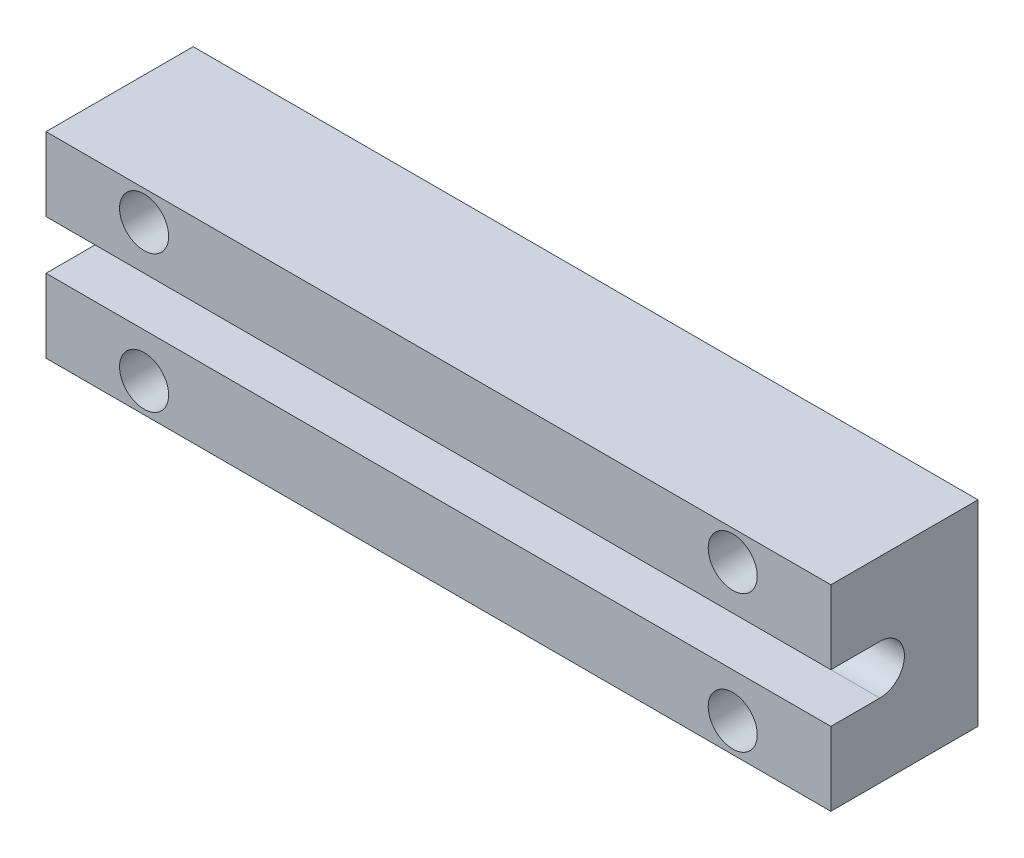
ISO-10303-21;
HEADER;
FILE_DESCRIPTION(('STEP AP214'),'2;1');
FILE_NAME('part.step','',(''),(''),'','','');
FILE_SCHEMA(('AUTOMOTIVE_DESIGN { 1 0 10303 214 1 1 1 1 }'));
ENDSEC;
DATA;
#1=APPLICATION_CONTEXT('core data for automotive mechanical design processes');
#2=APPLICATION_PROTOCOL_DEFINITION('international standard','automotive_design',2000,#1);
#3=PRODUCT_CONTEXT('',#1,'mechanical');
#4=PRODUCT('Part','Part','',(#3));
#5=PRODUCT_RELATED_PRODUCT_CATEGORY('part','',(#4));
#6=PRODUCT_DEFINITION_FORMATION('','',#4);
#7=PRODUCT_DEFINITION_CONTEXT('part definition',#1,'design');
#8=PRODUCT_DEFINITION('design','',#6,#7);
#9=PRODUCT_DEFINITION_SHAPE('','',#8);
#10=(LENGTH_UNIT() NAMED_UNIT(*) SI_UNIT(.MILLI.,.METRE.));
#11=(NAMED_UNIT(*) PLANE_ANGLE_UNIT() SI_UNIT($,.RADIAN.));
#12=(NAMED_UNIT(*) SI_UNIT($,.STERADIAN.) SOLID_ANGLE_UNIT());
#13=UNCERTAINTY_MEASURE_WITH_UNIT(LENGTH_MEASURE(1.E-05),#10,'distance_accuracy_value','');
#14=(GEOMETRIC_REPRESENTATION_CONTEXT(3) GLOBAL_UNCERTAINTY_ASSIGNED_CONTEXT((#13)) GLOBAL_UNIT_ASSIGNED_CONTEXT((#10,
#11,#12)) REPRESENTATION_CONTEXT('',''));
#15=CARTESIAN_POINT('',(0.,0.,0.));
#16=DIRECTION('',(0.,0.,1.));
#17=DIRECTION('',(1.,0.,0.));
#18=AXIS2_PLACEMENT_3D('',#15,#16,#17);
#19=CARTESIAN_POINT('',(0.,0.,15.));
#20=DIRECTION('',(0.,0.,1.));
#21=DIRECTION('',(1.,0.,0.));
#22=AXIS2_PLACEMENT_3D('',#19,#20,#21);
#23=PLANE('',#22);
#24=CARTESIAN_POINT('',(-70.,17.,15.));
#25=DIRECTION('',(0.,0.,1.));
#26=DIRECTION('',(1.,0.,0.));
#27=AXIS2_PLACEMENT_3D('',#24,#25,#26);
#28=CIRCLE('',#27,2.5);
#29=CARTESIAN_POINT('',(-67.5,17.,15.));
#30=VERTEX_POINT('',#29);
#31=EDGE_CURVE('E189',#30,#30,#28,.T.);
#32=ORIENTED_EDGE('',*,*,#31,.F.);
#33=EDGE_LOOP('',(#32));
#34=FACE_BOUND('',#33,.T.);
#35=CARTESIAN_POINT('',(-10.,17.,15.));
#36=DIRECTION('',(0.,0.,1.));
#37=DIRECTION('',(1.,0.,0.));
#38=AXIS2_PLACEMENT_3D('',#35,#36,#37);
#39=CIRCLE('',#38,2.5);
#40=CARTESIAN_POINT('',(-7.5,17.,15.));
#41=VERTEX_POINT('',#40);
#42=EDGE_CURVE('E122',#41,#41,#39,.T.);
#43=ORIENTED_EDGE('',*,*,#42,.F.);
#44=EDGE_LOOP('',(#43));
#45=FACE_BOUND('',#44,.T.);
#46=DIRECTION('',(-1.,0.,0.));
#47=VECTOR('',#46,1.);
#48=CARTESIAN_POINT('',(0.,12.5,15.));
#49=LINE('',#48,#47);
#50=CARTESIAN_POINT('',(0.,12.5,15.));
#51=VERTEX_POINT('',#50);
#52=CARTESIAN_POINT('',(-80.,12.5,15.));
#53=VERTEX_POINT('',#52);
#54=EDGE_CURVE('E41',#51,#53,#49,.T.);
#55=ORIENTED_EDGE('',*,*,#54,.F.);
#56=DIRECTION('',(0.,1.,0.));
#57=VECTOR('',#56,1.);
#58=CARTESIAN_POINT('',(0.,0.,15.));
#59=LINE('',#58,#57);
#60=CARTESIAN_POINT('',(0.,20.,15.));
#61=VERTEX_POINT('',#60);
#62=EDGE_CURVE('E86',#51,#61,#59,.T.);
#63=ORIENTED_EDGE('',*,*,#62,.T.);
#64=DIRECTION('',(-1.,0.,0.));
#65=VECTOR('',#64,1.);
#66=CARTESIAN_POINT('',(0.,20.,15.));
#67=LINE('',#66,#65);
#68=CARTESIAN_POINT('',(-80.,20.,15.));
#69=VERTEX_POINT('',#68);
#70=EDGE_CURVE('E125',#61,#69,#67,.T.);
#71=ORIENTED_EDGE('',*,*,#70,.T.);
#72=DIRECTION('',(0.,-1.,0.));
#73=VECTOR('',#72,1.);
#74=CARTESIAN_POINT('',(-80.,0.,15.));
#75=LINE('',#74,#73);
#76=EDGE_CURVE('E133',#69,#53,#75,.T.);
#77=ORIENTED_EDGE('',*,*,#76,.T.);
#78=EDGE_LOOP('',(#55,#63,#71,#77));
#79=FACE_BOUND('',#78,.T.);
#80=ADVANCED_FACE('F33',(#34,#45,#79),#23,.T.);
#81=CARTESIAN_POINT('',(0.,0.,15.));
#82=DIRECTION('',(-1.,0.,0.));
#83=DIRECTION('',(0.,0.,1.));
#84=AXIS2_PLACEMENT_3D('',#81,#82,#83);
#85=PLANE('',#84);
#86=ORIENTED_EDGE('',*,*,#62,.F.);
#87=DIRECTION('',(0.,0.,1.));
#88=VECTOR('',#87,1.);
#89=CARTESIAN_POINT('',(0.,12.5,15.));
#90=LINE('',#89,#88);
#91=CARTESIAN_POINT('',(0.,12.5,10.));
#92=VERTEX_POINT('',#91);
#93=EDGE_CURVE('E157',#92,#51,#90,.T.);
#94=ORIENTED_EDGE('',*,*,#93,.F.);
#95=CARTESIAN_POINT('',(0.,10.,10.));
#96=DIRECTION('',(1.,0.,0.));
#97=DIRECTION('',(0.,0.,-1.));
#98=AXIS2_PLACEMENT_3D('',#95,#96,#97);
#99=CIRCLE('',#98,2.5);
#100=CARTESIAN_POINT('',(0.,7.5,10.));
#101=VERTEX_POINT('',#100);
#102=EDGE_CURVE('E121',#101,#92,#99,.T.);
#103=ORIENTED_EDGE('',*,*,#102,.F.);
#104=DIRECTION('',(0.,0.,-1.));
#105=VECTOR('',#104,1.);
#106=CARTESIAN_POINT('',(0.,7.5,15.));
#107=LINE('',#106,#105);
#108=CARTESIAN_POINT('',(0.,7.5,15.));
#109=VERTEX_POINT('',#108);
#110=EDGE_CURVE('E111',#109,#101,#107,.T.);
#111=ORIENTED_EDGE('',*,*,#110,.F.);
#112=CARTESIAN_POINT('',(0.,0.,15.));
#113=VERTEX_POINT('',#112);
#114=EDGE_CURVE('E118',#113,#109,#59,.T.);
#115=ORIENTED_EDGE('',*,*,#114,.F.);
#116=DIRECTION('',(0.,0.,-1.));
#117=VECTOR('',#116,1.);
#118=CARTESIAN_POINT('',(0.,0.,15.));
#119=LINE('',#118,#117);
#120=CARTESIAN_POINT('',(0.,0.,0.));
#121=VERTEX_POINT('',#120);
#122=EDGE_CURVE('E137',#113,#121,#119,.T.);
#123=ORIENTED_EDGE('',*,*,#122,.T.);
#124=DIRECTION('',(0.,1.,0.));
#125=VECTOR('',#124,1.);
#126=CARTESIAN_POINT('',(0.,0.,0.));
#127=LINE('',#126,#125);
#128=CARTESIAN_POINT('',(0.,20.,0.));
#129=VERTEX_POINT('',#128);
#130=EDGE_CURVE('E138',#121,#129,#127,.T.);
#131=ORIENTED_EDGE('',*,*,#130,.T.);
#132=DIRECTION('',(0.,0.,-1.));
#133=VECTOR('',#132,1.);
#134=CARTESIAN_POINT('',(0.,20.,15.));
#135=LINE('',#134,#133);
#136=EDGE_CURVE('E114',#61,#129,#135,.T.);
#137=ORIENTED_EDGE('',*,*,#136,.F.);
#138=EDGE_LOOP('',(#86,#94,#103,#111,#115,#123,#131,#137));
#139=FACE_BOUND('',#138,.T.);
#140=ADVANCED_FACE('F35',(#139),#85,.F.);
#141=CARTESIAN_POINT('',(0.,20.,15.));
#142=DIRECTION('',(0.,-1.,0.));
#143=DIRECTION('',(1.,0.,0.));
#144=AXIS2_PLACEMENT_3D('',#141,#142,#143);
#145=PLANE('',#144);
#146=DIRECTION('',(-1.,0.,0.));
#147=VECTOR('',#146,1.);
#148=CARTESIAN_POINT('',(0.,20.,0.));
#149=LINE('',#148,#147);
#150=CARTESIAN_POINT('',(-80.,20.,0.));
#151=VERTEX_POINT('',#150);
#152=EDGE_CURVE('E141',#129,#151,#149,.T.);
#153=ORIENTED_EDGE('',*,*,#152,.T.);
#154=DIRECTION('',(0.,0.,-1.));
#155=VECTOR('',#154,1.);
#156=CARTESIAN_POINT('',(-80.,20.,15.));
#157=LINE('',#156,#155);
#158=EDGE_CURVE('E149',#69,#151,#157,.T.);
#159=ORIENTED_EDGE('',*,*,#158,.F.);
#160=ORIENTED_EDGE('',*,*,#70,.F.);
#161=ORIENTED_EDGE('',*,*,#136,.T.);
#162=EDGE_LOOP('',(#153,#159,#160,#161));
#163=FACE_BOUND('',#162,.T.);
#164=ADVANCED_FACE('F164',(#163),#145,.F.);
#165=CARTESIAN_POINT('',(-80.,0.,15.));
#166=DIRECTION('',(1.,0.,0.));
#167=DIRECTION('',(0.,0.,-1.));
#168=AXIS2_PLACEMENT_3D('',#165,#166,#167);
#169=PLANE('',#168);
#170=CARTESIAN_POINT('',(-80.,10.,10.));
#171=DIRECTION('',(1.,0.,0.));
#172=DIRECTION('',(0.,0.,-1.));
#173=AXIS2_PLACEMENT_3D('',#170,#171,#172);
#174=CIRCLE('',#173,2.5);
#175=CARTESIAN_POINT('',(-80.,7.5,10.));
#176=VERTEX_POINT('',#175);
#177=CARTESIAN_POINT('',(-80.,12.5,10.));
#178=VERTEX_POINT('',#177);
#179=EDGE_CURVE('E11',#176,#178,#174,.T.);
#180=ORIENTED_EDGE('',*,*,#179,.T.);
#181=DIRECTION('',(0.,0.,1.));
#182=VECTOR('',#181,1.);
#183=CARTESIAN_POINT('',(-80.,12.5,15.));
#184=LINE('',#183,#182);
#185=EDGE_CURVE('E130',#178,#53,#184,.T.);
#186=ORIENTED_EDGE('',*,*,#185,.T.);
#187=ORIENTED_EDGE('',*,*,#76,.F.);
#188=ORIENTED_EDGE('',*,*,#158,.T.);
#189=DIRECTION('',(0.,-1.,0.));
#190=VECTOR('',#189,1.);
#191=CARTESIAN_POINT('',(-80.,0.,0.));
#192=LINE('',#191,#190);
#193=CARTESIAN_POINT('',(-80.,0.,0.));
#194=VERTEX_POINT('',#193);
#195=EDGE_CURVE('E143',#151,#194,#192,.T.);
#196=ORIENTED_EDGE('',*,*,#195,.T.);
#197=DIRECTION('',(0.,0.,-1.));
#198=VECTOR('',#197,1.);
#199=CARTESIAN_POINT('',(-80.,0.,15.));
#200=LINE('',#199,#198);
#201=CARTESIAN_POINT('',(-80.,0.,15.));
#202=VERTEX_POINT('',#201);
#203=EDGE_CURVE('E147',#202,#194,#200,.T.);
#204=ORIENTED_EDGE('',*,*,#203,.F.);
#205=CARTESIAN_POINT('',(-80.,7.5,15.));
#206=VERTEX_POINT('',#205);
#207=EDGE_CURVE('E127',#206,#202,#75,.T.);
#208=ORIENTED_EDGE('',*,*,#207,.F.);
#209=DIRECTION('',(0.,0.,-1.));
#210=VECTOR('',#209,1.);
#211=CARTESIAN_POINT('',(-80.,7.5,15.));
#212=LINE('',#211,#210);
#213=EDGE_CURVE('E48',#206,#176,#212,.T.);
#214=ORIENTED_EDGE('',*,*,#213,.T.);
#215=EDGE_LOOP('',(#180,#186,#187,#188,#196,#204,#208,#214));
#216=FACE_BOUND('',#215,.T.);
#217=ADVANCED_FACE('F160',(#216),#169,.F.);
#218=CARTESIAN_POINT('',(0.,0.,15.));
#219=DIRECTION('',(0.,1.,0.));
#220=DIRECTION('',(-1.,0.,0.));
#221=AXIS2_PLACEMENT_3D('',#218,#219,#220);
#222=PLANE('',#221);
#223=DIRECTION('',(1.,0.,0.));
#224=VECTOR('',#223,1.);
#225=CARTESIAN_POINT('',(0.,0.,0.));
#226=LINE('',#225,#224);
#227=EDGE_CURVE('E78',#194,#121,#226,.T.);
#228=ORIENTED_EDGE('',*,*,#227,.T.);
#229=ORIENTED_EDGE('',*,*,#122,.F.);
#230=DIRECTION('',(1.,0.,0.));
#231=VECTOR('',#230,1.);
#232=CARTESIAN_POINT('',(0.,0.,15.));
#233=LINE('',#232,#231);
#234=EDGE_CURVE('E57',#202,#113,#233,.T.);
#235=ORIENTED_EDGE('',*,*,#234,.F.);
#236=ORIENTED_EDGE('',*,*,#203,.T.);
#237=EDGE_LOOP('',(#228,#229,#235,#236));
#238=FACE_BOUND('',#237,.T.);
#239=ADVANCED_FACE('F170',(#238),#222,.F.);
#240=CARTESIAN_POINT('',(-70.,2.99999999999999,15.));
#241=DIRECTION('',(0.,0.,1.));
#242=DIRECTION('',(1.,0.,0.));
#243=AXIS2_PLACEMENT_3D('',#240,#241,#242);
#244=CIRCLE('',#243,2.5);
#245=CARTESIAN_POINT('',(-67.5,2.99999999999999,15.));
#246=VERTEX_POINT('',#245);
#247=EDGE_CURVE('E195',#246,#246,#244,.T.);
#248=ORIENTED_EDGE('',*,*,#247,.F.);
#249=EDGE_LOOP('',(#248));
#250=FACE_BOUND('',#249,.T.);
#251=CARTESIAN_POINT('',(-9.99999999999999,2.99999999999999,15.));
#252=DIRECTION('',(0.,0.,1.));
#253=DIRECTION('',(1.,0.,0.));
#254=AXIS2_PLACEMENT_3D('',#251,#252,#253);
#255=CIRCLE('',#254,2.5);
#256=CARTESIAN_POINT('',(-7.49999999999999,2.99999999999999,15.));
#257=VERTEX_POINT('',#256);
#258=EDGE_CURVE('E183',#257,#257,#255,.T.);
#259=ORIENTED_EDGE('',*,*,#258,.F.);
#260=EDGE_LOOP('',(#259));
#261=FACE_BOUND('',#260,.T.);
#262=DIRECTION('',(1.,0.,0.));
#263=VECTOR('',#262,1.);
#264=CARTESIAN_POINT('',(0.,7.5,15.));
#265=LINE('',#264,#263);
#266=EDGE_CURVE('E108',#206,#109,#265,.T.);
#267=ORIENTED_EDGE('',*,*,#266,.F.);
#268=ORIENTED_EDGE('',*,*,#207,.T.);
#269=ORIENTED_EDGE('',*,*,#234,.T.);
#270=ORIENTED_EDGE('',*,*,#114,.T.);
#271=EDGE_LOOP('',(#267,#268,#269,#270));
#272=FACE_BOUND('',#271,.T.);
#273=ADVANCED_FACE('F124',(#250,#261,#272),#23,.T.);
#274=CARTESIAN_POINT('',(0.,0.,0.));
#275=DIRECTION('',(0.,0.,1.));
#276=DIRECTION('',(1.,0.,0.));
#277=AXIS2_PLACEMENT_3D('',#274,#275,#276);
#278=PLANE('',#277);
#279=CARTESIAN_POINT('',(-70.,2.99999999999999,0.));
#280=DIRECTION('',(0.,0.,-1.));
#281=DIRECTION('',(-1.,0.,0.));
#282=AXIS2_PLACEMENT_3D('',#279,#280,#281);
#283=CIRCLE('',#282,2.5);
#284=CARTESIAN_POINT('',(-72.5,2.99999999999999,0.));
#285=VERTEX_POINT('',#284);
#286=EDGE_CURVE('E198',#285,#285,#283,.T.);
#287=ORIENTED_EDGE('',*,*,#286,.F.);
#288=EDGE_LOOP('',(#287));
#289=FACE_BOUND('',#288,.T.);
#290=CARTESIAN_POINT('',(-70.,17.,0.));
#291=DIRECTION('',(0.,0.,-1.));
#292=DIRECTION('',(-1.,0.,0.));
#293=AXIS2_PLACEMENT_3D('',#290,#291,#292);
#294=CIRCLE('',#293,2.5);
#295=CARTESIAN_POINT('',(-72.5,17.,0.));
#296=VERTEX_POINT('',#295);
#297=EDGE_CURVE('E192',#296,#296,#294,.T.);
#298=ORIENTED_EDGE('',*,*,#297,.F.);
#299=EDGE_LOOP('',(#298));
#300=FACE_BOUND('',#299,.T.);
#301=CARTESIAN_POINT('',(-9.99999999999999,2.99999999999999,0.));
#302=DIRECTION('',(0.,0.,-1.));
#303=DIRECTION('',(-1.,0.,0.));
#304=AXIS2_PLACEMENT_3D('',#301,#302,#303);
#305=CIRCLE('',#304,2.5);
#306=CARTESIAN_POINT('',(-12.5,2.99999999999999,0.));
#307=VERTEX_POINT('',#306);
#308=EDGE_CURVE('E186',#307,#307,#305,.T.);
#309=ORIENTED_EDGE('',*,*,#308,.F.);
#310=EDGE_LOOP('',(#309));
#311=FACE_BOUND('',#310,.T.);
#312=CARTESIAN_POINT('',(-10.,17.,0.));
#313=DIRECTION('',(0.,0.,-1.));
#314=DIRECTION('',(-1.,0.,0.));
#315=AXIS2_PLACEMENT_3D('',#312,#313,#314);
#316=CIRCLE('',#315,2.5);
#317=CARTESIAN_POINT('',(-12.5,17.,0.));
#318=VERTEX_POINT('',#317);
#319=EDGE_CURVE('E180',#318,#318,#316,.T.);
#320=ORIENTED_EDGE('',*,*,#319,.F.);
#321=EDGE_LOOP('',(#320));
#322=FACE_BOUND('',#321,.T.);
#323=ORIENTED_EDGE('',*,*,#130,.F.);
#324=ORIENTED_EDGE('',*,*,#227,.F.);
#325=ORIENTED_EDGE('',*,*,#195,.F.);
#326=ORIENTED_EDGE('',*,*,#152,.F.);
#327=EDGE_LOOP('',(#323,#324,#325,#326));
#328=FACE_BOUND('',#327,.T.);
#329=ADVANCED_FACE('F169',(#289,#300,#311,#322,#328),#278,.F.);
#330=CARTESIAN_POINT('',(-94.,10.,10.));
#331=DIRECTION('',(1.,0.,0.));
#332=DIRECTION('',(0.,0.,-1.));
#333=AXIS2_PLACEMENT_3D('',#330,#331,#332);
#334=CYLINDRICAL_SURFACE('',#333,2.5);
#335=DIRECTION('',(1.,0.,0.));
#336=VECTOR('',#335,1.);
#337=CARTESIAN_POINT('',(-94.,7.5,10.));
#338=LINE('',#337,#336);
#339=EDGE_CURVE('E172',#176,#101,#338,.T.);
#340=ORIENTED_EDGE('',*,*,#339,.T.);
#341=ORIENTED_EDGE('',*,*,#102,.T.);
#342=DIRECTION('',(1.,0.,0.));
#343=VECTOR('',#342,1.);
#344=CARTESIAN_POINT('',(-94.,12.5,10.));
#345=LINE('',#344,#343);
#346=EDGE_CURVE('E171',#178,#92,#345,.T.);
#347=ORIENTED_EDGE('',*,*,#346,.F.);
#348=ORIENTED_EDGE('',*,*,#179,.F.);
#349=EDGE_LOOP('',(#340,#341,#347,#348));
#350=FACE_BOUND('',#349,.T.);
#351=ADVANCED_FACE('F206',(#350),#334,.F.);
#352=CARTESIAN_POINT('',(-94.,12.5,15.));
#353=DIRECTION('',(0.,1.,0.));
#354=DIRECTION('',(0.,0.,1.));
#355=AXIS2_PLACEMENT_3D('',#352,#353,#354);
#356=PLANE('',#355);
#357=ORIENTED_EDGE('',*,*,#346,.T.);
#358=ORIENTED_EDGE('',*,*,#93,.T.);
#359=ORIENTED_EDGE('',*,*,#54,.T.);
#360=ORIENTED_EDGE('',*,*,#185,.F.);
#361=EDGE_LOOP('',(#357,#358,#359,#360));
#362=FACE_BOUND('',#361,.T.);
#363=ADVANCED_FACE('F155',(#362),#356,.F.);
#364=CARTESIAN_POINT('',(-94.,7.5,15.));
#365=DIRECTION('',(0.,-1.,0.));
#366=DIRECTION('',(0.,0.,-1.));
#367=AXIS2_PLACEMENT_3D('',#364,#365,#366);
#368=PLANE('',#367);
#369=ORIENTED_EDGE('',*,*,#266,.T.);
#370=ORIENTED_EDGE('',*,*,#110,.T.);
#371=ORIENTED_EDGE('',*,*,#339,.F.);
#372=ORIENTED_EDGE('',*,*,#213,.F.);
#373=EDGE_LOOP('',(#369,#370,#371,#372));
#374=FACE_BOUND('',#373,.T.);
#375=ADVANCED_FACE('F110',(#374),#368,.F.);
#376=CARTESIAN_POINT('',(-10.,17.,94.));
#377=DIRECTION('',(0.,0.,-1.));
#378=DIRECTION('',(-1.,0.,0.));
#379=AXIS2_PLACEMENT_3D('',#376,#377,#378);
#380=CYLINDRICAL_SURFACE('',#379,2.5);
#381=ORIENTED_EDGE('',*,*,#42,.T.);
#382=EDGE_LOOP('',(#381));
#383=FACE_BOUND('',#382,.T.);
#384=ORIENTED_EDGE('',*,*,#319,.T.);
#385=EDGE_LOOP('',(#384));
#386=FACE_BOUND('',#385,.T.);
#387=ADVANCED_FACE('F214',(#383,#386),#380,.F.);
#388=CARTESIAN_POINT('',(-9.99999999999999,2.99999999999999,94.));
#389=DIRECTION('',(0.,0.,-1.));
#390=DIRECTION('',(-1.,0.,0.));
#391=AXIS2_PLACEMENT_3D('',#388,#389,#390);
#392=CYLINDRICAL_SURFACE('',#391,2.5);
#393=ORIENTED_EDGE('',*,*,#258,.T.);
#394=EDGE_LOOP('',(#393));
#395=FACE_BOUND('',#394,.T.);
#396=ORIENTED_EDGE('',*,*,#308,.T.);
#397=EDGE_LOOP('',(#396));
#398=FACE_BOUND('',#397,.T.);
#399=ADVANCED_FACE('F216',(#395,#398),#392,.F.);
#400=CARTESIAN_POINT('',(-70.,17.,94.));
#401=DIRECTION('',(0.,0.,-1.));
#402=DIRECTION('',(-1.,0.,0.));
#403=AXIS2_PLACEMENT_3D('',#400,#401,#402);
#404=CYLINDRICAL_SURFACE('',#403,2.5);
#405=ORIENTED_EDGE('',*,*,#31,.T.);
#406=EDGE_LOOP('',(#405));
#407=FACE_BOUND('',#406,.T.);
#408=ORIENTED_EDGE('',*,*,#297,.T.);
#409=EDGE_LOOP('',(#408));
#410=FACE_BOUND('',#409,.T.);
#411=ADVANCED_FACE('F223',(#407,#410),#404,.F.);
#412=CARTESIAN_POINT('',(-70.,2.99999999999999,94.));
#413=DIRECTION('',(0.,0.,-1.));
#414=DIRECTION('',(-1.,0.,0.));
#415=AXIS2_PLACEMENT_3D('',#412,#413,#414);
#416=CYLINDRICAL_SURFACE('',#415,2.5);
#417=ORIENTED_EDGE('',*,*,#247,.T.);
#418=EDGE_LOOP('',(#417));
#419=FACE_BOUND('',#418,.T.);
#420=ORIENTED_EDGE('',*,*,#286,.T.);
#421=EDGE_LOOP('',(#420));
#422=FACE_BOUND('',#421,.T.);
#423=ADVANCED_FACE('F202',(#419,#422),#416,.F.);
#424=CLOSED_SHELL('',(#80,#140,#164,#217,#239,#273,#329,#351,#363,#375,#387,#399,#411,#423));
#425=MANIFOLD_SOLID_BREP('B2',#424);
#426=ADVANCED_BREP_SHAPE_REPRESENTATION('',(#18,#425),#14);
#427=SHAPE_DEFINITION_REPRESENTATION(#9,#426);
ENDSEC;
END-ISO-10303-21;
